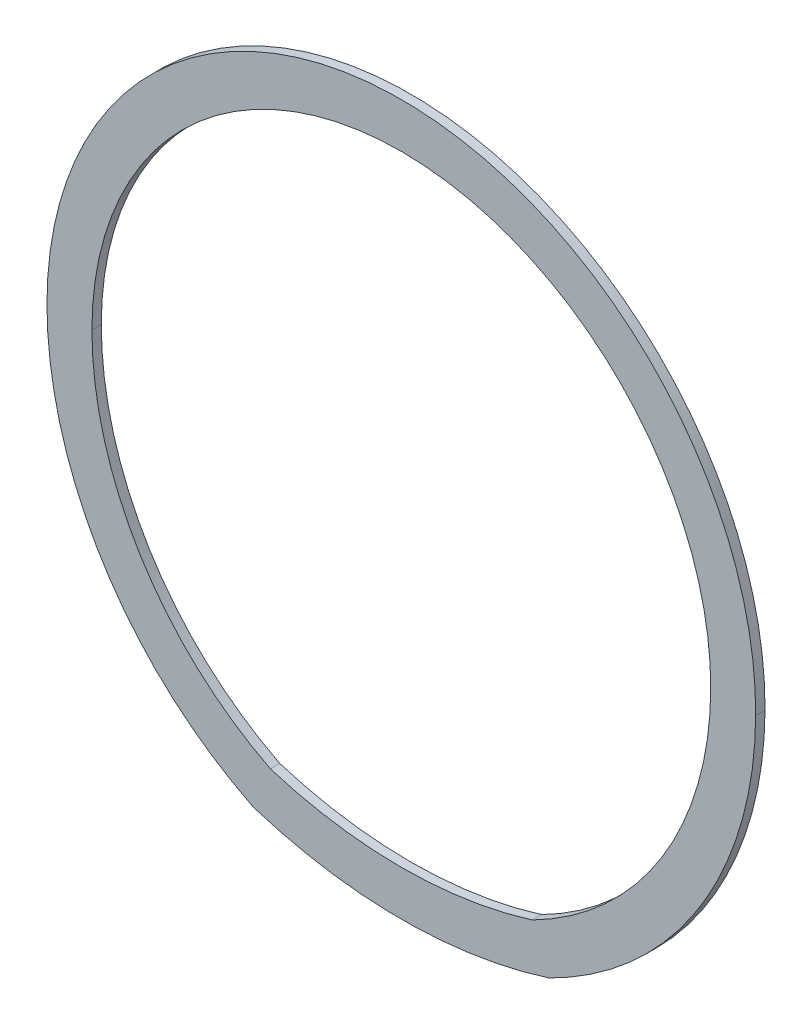
ISO-10303-21;
HEADER;
FILE_DESCRIPTION(('STEP AP214'),'2;1');
FILE_NAME('part.step','',(''),(''),'','','');
FILE_SCHEMA(('AUTOMOTIVE_DESIGN { 1 0 10303 214 1 1 1 1 }'));
ENDSEC;
DATA;
#1=APPLICATION_CONTEXT('core data for automotive mechanical design processes');
#2=APPLICATION_PROTOCOL_DEFINITION('international standard','automotive_design',2000,#1);
#3=PRODUCT_CONTEXT('',#1,'mechanical');
#4=PRODUCT('Part','Part','',(#3));
#5=PRODUCT_RELATED_PRODUCT_CATEGORY('part','',(#4));
#6=PRODUCT_DEFINITION_FORMATION('','',#4);
#7=PRODUCT_DEFINITION_CONTEXT('part definition',#1,'design');
#8=PRODUCT_DEFINITION('design','',#6,#7);
#9=PRODUCT_DEFINITION_SHAPE('','',#8);
#10=(LENGTH_UNIT() NAMED_UNIT(*) SI_UNIT(.MILLI.,.METRE.));
#11=(NAMED_UNIT(*) PLANE_ANGLE_UNIT() SI_UNIT($,.RADIAN.));
#12=(NAMED_UNIT(*) SI_UNIT($,.STERADIAN.) SOLID_ANGLE_UNIT());
#13=UNCERTAINTY_MEASURE_WITH_UNIT(LENGTH_MEASURE(1.E-05),#10,'distance_accuracy_value','');
#14=(GEOMETRIC_REPRESENTATION_CONTEXT(3) GLOBAL_UNCERTAINTY_ASSIGNED_CONTEXT((#13)) GLOBAL_UNIT_ASSIGNED_CONTEXT((#10,
#11,#12)) REPRESENTATION_CONTEXT('',''));
#15=CARTESIAN_POINT('',(0.,0.,0.));
#16=DIRECTION('',(0.,0.,1.));
#17=DIRECTION('',(1.,0.,0.));
#18=AXIS2_PLACEMENT_3D('',#15,#16,#17);
#19=CARTESIAN_POINT('',(2.87745258300709,41.275,1.5875));
#20=DIRECTION('',(0.,0.,1.));
#21=DIRECTION('',(1.,0.,0.));
#22=AXIS2_PLACEMENT_3D('',#19,#20,#21);
#23=PLANE('',#22);
#24=CARTESIAN_POINT('',(5.71473106786189,19.0500000000001,1.5875));
#25=DIRECTION('',(0.,0.,1.));
#26=DIRECTION('',(1.,0.,0.));
#27=AXIS2_PLACEMENT_3D('',#24,#25,#26);
#28=CIRCLE('',#27,125.813626794521);
#29=CARTESIAN_POINT('',(-120.098895726659,19.05,1.5875));
#30=VERTEX_POINT('',#29);
#31=CARTESIAN_POINT('',(-50.0584032460589,-93.7259999999829,1.5875));
#32=VERTEX_POINT('',#31);
#33=EDGE_CURVE('E138',#30,#32,#28,.T.);
#34=ORIENTED_EDGE('',*,*,#33,.T.);
#35=CARTESIAN_POINT('',(0.0401740981522854,63.5,1.5875));
#36=DIRECTION('',(0.,0.,1.));
#37=DIRECTION('',(1.,0.,0.));
#38=AXIS2_PLACEMENT_3D('',#35,#36,#37);
#39=CIRCLE('',#38,165.014794875819);
#40=CARTESIAN_POINT('',(50.138751442251,-93.726,1.5875));
#41=VERTEX_POINT('',#40);
#42=EDGE_CURVE('E141',#32,#41,#39,.T.);
#43=ORIENTED_EDGE('',*,*,#42,.T.);
#44=CARTESIAN_POINT('',(-5.64062361813422,19.0834910459425,1.5875));
#45=DIRECTION('',(0.,0.,1.));
#46=DIRECTION('',(-1.,0.,0.));
#47=AXIS2_PLACEMENT_3D('',#44,#45,#46);
#48=CIRCLE('',#47,125.846414141094);
#49=CARTESIAN_POINT('',(120.203613721784,18.3433015446214,1.5875));
#50=VERTEX_POINT('',#49);
#51=EDGE_CURVE('E144',#41,#50,#48,.T.);
#52=ORIENTED_EDGE('',*,*,#51,.T.);
#53=CARTESIAN_POINT('',(0.0533981517267298,19.05,1.5875));
#54=DIRECTION('',(0.,0.,1.));
#55=DIRECTION('',(-1.,0.,0.));
#56=AXIS2_PLACEMENT_3D('',#53,#54,#55);
#57=CIRCLE('',#56,120.152293878386);
#58=EDGE_CURVE('E146',#50,#30,#57,.T.);
#59=ORIENTED_EDGE('',*,*,#58,.T.);
#60=EDGE_LOOP('',(#34,#43,#52,#59));
#61=FACE_BOUND('',#60,.T.);
#62=CARTESIAN_POINT('',(0.0401740981522854,63.5,1.5875));
#63=DIRECTION('',(0.,0.,1.));
#64=DIRECTION('',(1.,0.,0.));
#65=AXIS2_PLACEMENT_3D('',#62,#63,#64);
#66=CIRCLE('',#65,149.774794875837);
#67=CARTESIAN_POINT('',(-44.3239593744346,-79.5535313836238,1.5875));
#68=VERTEX_POINT('',#67);
#69=CARTESIAN_POINT('',(44.4048605696805,-79.5533598849547,1.5875));
#70=VERTEX_POINT('',#69);
#71=EDGE_CURVE('E110',#68,#70,#66,.T.);
#72=ORIENTED_EDGE('',*,*,#71,.F.);
#73=CARTESIAN_POINT('',(5.71473106786189,19.0500000000001,1.5875));
#74=DIRECTION('',(0.,0.,1.));
#75=DIRECTION('',(1.,0.,0.));
#76=AXIS2_PLACEMENT_3D('',#73,#74,#75);
#77=CIRCLE('',#76,110.573626794554);
#78=CARTESIAN_POINT('',(-104.858895726692,19.05,1.5875));
#79=VERTEX_POINT('',#78);
#80=EDGE_CURVE('E102',#79,#68,#77,.T.);
#81=ORIENTED_EDGE('',*,*,#80,.F.);
#82=CARTESIAN_POINT('',(0.0533981517267298,19.05,1.5875));
#83=DIRECTION('',(0.,0.,1.));
#84=DIRECTION('',(-1.,0.,0.));
#85=AXIS2_PLACEMENT_3D('',#82,#83,#84);
#86=CIRCLE('',#85,104.912293878419);
#87=CARTESIAN_POINT('',(104.963877332422,18.4329384888053,1.5875));
#88=VERTEX_POINT('',#87);
#89=EDGE_CURVE('E124',#88,#79,#86,.T.);
#90=ORIENTED_EDGE('',*,*,#89,.F.);
#91=CARTESIAN_POINT('',(-5.64062361813422,19.0834910459425,1.5875));
#92=DIRECTION('',(0.,0.,1.));
#93=DIRECTION('',(-1.,0.,0.));
#94=AXIS2_PLACEMENT_3D('',#91,#92,#93);
#95=CIRCLE('',#94,110.60641414112);
#96=EDGE_CURVE('E122',#70,#88,#95,.T.);
#97=ORIENTED_EDGE('',*,*,#96,.F.);
#98=EDGE_LOOP('',(#72,#81,#90,#97));
#99=FACE_BOUND('',#98,.T.);
#100=ADVANCED_FACE('F37',(#61,#99),#23,.T.);
#101=CARTESIAN_POINT('',(2.87745258300709,41.275,-1.5875));
#102=DIRECTION('',(0.,0.,1.));
#103=DIRECTION('',(1.,0.,0.));
#104=AXIS2_PLACEMENT_3D('',#101,#102,#103);
#105=PLANE('',#104);
#106=CARTESIAN_POINT('',(5.71473106786189,19.0500000000001,-1.5875));
#107=DIRECTION('',(0.,0.,1.));
#108=DIRECTION('',(1.,0.,0.));
#109=AXIS2_PLACEMENT_3D('',#106,#107,#108);
#110=CIRCLE('',#109,125.813626794521);
#111=CARTESIAN_POINT('',(-120.098895726659,19.05,-1.5875));
#112=VERTEX_POINT('',#111);
#113=CARTESIAN_POINT('',(-50.0584032460589,-93.7259999999829,-1.5875));
#114=VERTEX_POINT('',#113);
#115=EDGE_CURVE('E118',#112,#114,#110,.T.);
#116=ORIENTED_EDGE('',*,*,#115,.F.);
#117=CARTESIAN_POINT('',(0.0533981517267298,19.05,-1.5875));
#118=DIRECTION('',(0.,0.,1.));
#119=DIRECTION('',(-1.,0.,0.));
#120=AXIS2_PLACEMENT_3D('',#117,#118,#119);
#121=CIRCLE('',#120,120.152293878386);
#122=CARTESIAN_POINT('',(120.203613721784,18.3433015446214,-1.5875));
#123=VERTEX_POINT('',#122);
#124=EDGE_CURVE('E142',#123,#112,#121,.T.);
#125=ORIENTED_EDGE('',*,*,#124,.F.);
#126=CARTESIAN_POINT('',(-5.64062361813422,19.0834910459425,-1.5875));
#127=DIRECTION('',(0.,0.,1.));
#128=DIRECTION('',(-1.,0.,0.));
#129=AXIS2_PLACEMENT_3D('',#126,#127,#128);
#130=CIRCLE('',#129,125.846414141094);
#131=CARTESIAN_POINT('',(50.138751442251,-93.726,-1.5875));
#132=VERTEX_POINT('',#131);
#133=EDGE_CURVE('E153',#132,#123,#130,.T.);
#134=ORIENTED_EDGE('',*,*,#133,.F.);
#135=CARTESIAN_POINT('',(0.0401740981522854,63.5,-1.5875));
#136=DIRECTION('',(0.,0.,1.));
#137=DIRECTION('',(1.,0.,0.));
#138=AXIS2_PLACEMENT_3D('',#135,#136,#137);
#139=CIRCLE('',#138,165.014794875819);
#140=EDGE_CURVE('E151',#114,#132,#139,.T.);
#141=ORIENTED_EDGE('',*,*,#140,.F.);
#142=EDGE_LOOP('',(#116,#125,#134,#141));
#143=FACE_BOUND('',#142,.T.);
#144=CARTESIAN_POINT('',(5.71473106786189,19.0500000000001,-1.5875));
#145=DIRECTION('',(0.,0.,1.));
#146=DIRECTION('',(1.,0.,0.));
#147=AXIS2_PLACEMENT_3D('',#144,#145,#146);
#148=CIRCLE('',#147,110.573626794554);
#149=CARTESIAN_POINT('',(-104.858895726692,19.05,-1.5875));
#150=VERTEX_POINT('',#149);
#151=CARTESIAN_POINT('',(-44.3239593744346,-79.5535313836238,-1.5875));
#152=VERTEX_POINT('',#151);
#153=EDGE_CURVE('E60',#150,#152,#148,.T.);
#154=ORIENTED_EDGE('',*,*,#153,.T.);
#155=CARTESIAN_POINT('',(0.0401740981522854,63.5,-1.5875));
#156=DIRECTION('',(0.,0.,1.));
#157=DIRECTION('',(1.,0.,0.));
#158=AXIS2_PLACEMENT_3D('',#155,#156,#157);
#159=CIRCLE('',#158,149.774794875837);
#160=CARTESIAN_POINT('',(44.4048605696805,-79.5533598849547,-1.5875));
#161=VERTEX_POINT('',#160);
#162=EDGE_CURVE('E117',#152,#161,#159,.T.);
#163=ORIENTED_EDGE('',*,*,#162,.T.);
#164=CARTESIAN_POINT('',(-5.64062361813422,19.0834910459425,-1.5875));
#165=DIRECTION('',(0.,0.,1.));
#166=DIRECTION('',(-1.,0.,0.));
#167=AXIS2_PLACEMENT_3D('',#164,#165,#166);
#168=CIRCLE('',#167,110.60641414112);
#169=CARTESIAN_POINT('',(104.963877332422,18.4329384888053,-1.5875));
#170=VERTEX_POINT('',#169);
#171=EDGE_CURVE('E130',#161,#170,#168,.T.);
#172=ORIENTED_EDGE('',*,*,#171,.T.);
#173=CARTESIAN_POINT('',(0.0533981517267298,19.05,-1.5875));
#174=DIRECTION('',(0.,0.,1.));
#175=DIRECTION('',(-1.,0.,0.));
#176=AXIS2_PLACEMENT_3D('',#173,#174,#175);
#177=CIRCLE('',#176,104.912293878419);
#178=EDGE_CURVE('E111',#170,#150,#177,.T.);
#179=ORIENTED_EDGE('',*,*,#178,.T.);
#180=EDGE_LOOP('',(#154,#163,#172,#179));
#181=FACE_BOUND('',#180,.T.);
#182=ADVANCED_FACE('F171',(#143,#181),#105,.F.);
#183=CARTESIAN_POINT('',(5.71473106786189,19.0500000000001,1.5875));
#184=DIRECTION('',(0.,0.,-1.));
#185=DIRECTION('',(-1.,0.,0.));
#186=AXIS2_PLACEMENT_3D('',#183,#184,#185);
#187=CYLINDRICAL_SURFACE('',#186,125.813626794521);
#188=ORIENTED_EDGE('',*,*,#115,.T.);
#189=DIRECTION('',(0.,0.,-1.));
#190=VECTOR('',#189,1.);
#191=CARTESIAN_POINT('',(-50.0584032460589,-93.7259999999829,1.5875));
#192=LINE('',#191,#190);
#193=EDGE_CURVE('E11',#32,#114,#192,.T.);
#194=ORIENTED_EDGE('',*,*,#193,.F.);
#195=ORIENTED_EDGE('',*,*,#33,.F.);
#196=DIRECTION('',(0.,0.,-1.));
#197=VECTOR('',#196,1.);
#198=CARTESIAN_POINT('',(-120.098895726659,19.05,1.5875));
#199=LINE('',#198,#197);
#200=EDGE_CURVE('E148',#30,#112,#199,.T.);
#201=ORIENTED_EDGE('',*,*,#200,.T.);
#202=EDGE_LOOP('',(#188,#194,#195,#201));
#203=FACE_BOUND('',#202,.T.);
#204=ADVANCED_FACE('F39',(#203),#187,.T.);
#205=CARTESIAN_POINT('',(0.0401740981522854,63.5,1.5875));
#206=DIRECTION('',(0.,0.,-1.));
#207=DIRECTION('',(-1.,0.,0.));
#208=AXIS2_PLACEMENT_3D('',#205,#206,#207);
#209=CYLINDRICAL_SURFACE('',#208,165.014794875819);
#210=ORIENTED_EDGE('',*,*,#140,.T.);
#211=DIRECTION('',(0.,0.,-1.));
#212=VECTOR('',#211,1.);
#213=CARTESIAN_POINT('',(50.138751442251,-93.726,1.5875));
#214=LINE('',#213,#212);
#215=EDGE_CURVE('E45',#41,#132,#214,.T.);
#216=ORIENTED_EDGE('',*,*,#215,.F.);
#217=ORIENTED_EDGE('',*,*,#42,.F.);
#218=ORIENTED_EDGE('',*,*,#193,.T.);
#219=EDGE_LOOP('',(#210,#216,#217,#218));
#220=FACE_BOUND('',#219,.T.);
#221=ADVANCED_FACE('F181',(#220),#209,.T.);
#222=CARTESIAN_POINT('',(-5.64062361813422,19.0834910459425,1.5875));
#223=DIRECTION('',(0.,0.,-1.));
#224=DIRECTION('',(-1.,0.,0.));
#225=AXIS2_PLACEMENT_3D('',#222,#223,#224);
#226=CYLINDRICAL_SURFACE('',#225,125.846414141094);
#227=ORIENTED_EDGE('',*,*,#133,.T.);
#228=DIRECTION('',(0.,0.,-1.));
#229=VECTOR('',#228,1.);
#230=CARTESIAN_POINT('',(120.203613721784,18.3433015446214,1.5875));
#231=LINE('',#230,#229);
#232=EDGE_CURVE('E158',#50,#123,#231,.T.);
#233=ORIENTED_EDGE('',*,*,#232,.F.);
#234=ORIENTED_EDGE('',*,*,#51,.F.);
#235=ORIENTED_EDGE('',*,*,#215,.T.);
#236=EDGE_LOOP('',(#227,#233,#234,#235));
#237=FACE_BOUND('',#236,.T.);
#238=ADVANCED_FACE('F165',(#237),#226,.T.);
#239=CARTESIAN_POINT('',(0.0533981517267298,19.05,1.5875));
#240=DIRECTION('',(0.,0.,-1.));
#241=DIRECTION('',(-1.,0.,0.));
#242=AXIS2_PLACEMENT_3D('',#239,#240,#241);
#243=CYLINDRICAL_SURFACE('',#242,120.152293878386);
#244=ORIENTED_EDGE('',*,*,#124,.T.);
#245=ORIENTED_EDGE('',*,*,#200,.F.);
#246=ORIENTED_EDGE('',*,*,#58,.F.);
#247=ORIENTED_EDGE('',*,*,#232,.T.);
#248=EDGE_LOOP('',(#244,#245,#246,#247));
#249=FACE_BOUND('',#248,.T.);
#250=ADVANCED_FACE('F175',(#249),#243,.T.);
#251=CARTESIAN_POINT('',(5.71473106786189,19.0500000000001,1.5875));
#252=DIRECTION('',(0.,0.,-1.));
#253=DIRECTION('',(-1.,0.,0.));
#254=AXIS2_PLACEMENT_3D('',#251,#252,#253);
#255=CYLINDRICAL_SURFACE('',#254,110.573626794554);
#256=ORIENTED_EDGE('',*,*,#153,.F.);
#257=DIRECTION('',(0.,0.,-1.));
#258=VECTOR('',#257,1.);
#259=CARTESIAN_POINT('',(-104.858895726692,19.05,1.5875));
#260=LINE('',#259,#258);
#261=EDGE_CURVE('E106',#79,#150,#260,.T.);
#262=ORIENTED_EDGE('',*,*,#261,.F.);
#263=ORIENTED_EDGE('',*,*,#80,.T.);
#264=DIRECTION('',(0.,0.,-1.));
#265=VECTOR('',#264,1.);
#266=CARTESIAN_POINT('',(-44.3239593744346,-79.5535313836238,1.5875));
#267=LINE('',#266,#265);
#268=EDGE_CURVE('E105',#68,#152,#267,.T.);
#269=ORIENTED_EDGE('',*,*,#268,.T.);
#270=EDGE_LOOP('',(#256,#262,#263,#269));
#271=FACE_BOUND('',#270,.T.);
#272=ADVANCED_FACE('F104',(#271),#255,.F.);
#273=CARTESIAN_POINT('',(0.0401740981522854,63.5,1.5875));
#274=DIRECTION('',(0.,0.,-1.));
#275=DIRECTION('',(-1.,0.,0.));
#276=AXIS2_PLACEMENT_3D('',#273,#274,#275);
#277=CYLINDRICAL_SURFACE('',#276,149.774794875837);
#278=ORIENTED_EDGE('',*,*,#162,.F.);
#279=ORIENTED_EDGE('',*,*,#268,.F.);
#280=ORIENTED_EDGE('',*,*,#71,.T.);
#281=DIRECTION('',(0.,0.,-1.));
#282=VECTOR('',#281,1.);
#283=CARTESIAN_POINT('',(44.4048605696805,-79.5533598849547,1.5875));
#284=LINE('',#283,#282);
#285=EDGE_CURVE('E119',#70,#161,#284,.T.);
#286=ORIENTED_EDGE('',*,*,#285,.T.);
#287=EDGE_LOOP('',(#278,#279,#280,#286));
#288=FACE_BOUND('',#287,.T.);
#289=ADVANCED_FACE('F114',(#288),#277,.F.);
#290=CARTESIAN_POINT('',(-5.64062361813422,19.0834910459425,1.5875));
#291=DIRECTION('',(0.,0.,-1.));
#292=DIRECTION('',(-1.,0.,0.));
#293=AXIS2_PLACEMENT_3D('',#290,#291,#292);
#294=CYLINDRICAL_SURFACE('',#293,110.60641414112);
#295=ORIENTED_EDGE('',*,*,#171,.F.);
#296=ORIENTED_EDGE('',*,*,#285,.F.);
#297=ORIENTED_EDGE('',*,*,#96,.T.);
#298=DIRECTION('',(0.,0.,-1.));
#299=VECTOR('',#298,1.);
#300=CARTESIAN_POINT('',(104.963877332422,18.4329384888053,1.5875));
#301=LINE('',#300,#299);
#302=EDGE_CURVE('E52',#88,#170,#301,.T.);
#303=ORIENTED_EDGE('',*,*,#302,.T.);
#304=EDGE_LOOP('',(#295,#296,#297,#303));
#305=FACE_BOUND('',#304,.T.);
#306=ADVANCED_FACE('F204',(#305),#294,.F.);
#307=CARTESIAN_POINT('',(0.0533981517267298,19.05,1.5875));
#308=DIRECTION('',(0.,0.,-1.));
#309=DIRECTION('',(-1.,0.,0.));
#310=AXIS2_PLACEMENT_3D('',#307,#308,#309);
#311=CYLINDRICAL_SURFACE('',#310,104.912293878419);
#312=ORIENTED_EDGE('',*,*,#178,.F.);
#313=ORIENTED_EDGE('',*,*,#302,.F.);
#314=ORIENTED_EDGE('',*,*,#89,.T.);
#315=ORIENTED_EDGE('',*,*,#261,.T.);
#316=EDGE_LOOP('',(#312,#313,#314,#315));
#317=FACE_BOUND('',#316,.T.);
#318=ADVANCED_FACE('F208',(#317),#311,.F.);
#319=CLOSED_SHELL('',(#100,#182,#204,#221,#238,#250,#272,#289,#306,#318));
#320=MANIFOLD_SOLID_BREP('B2',#319);
#321=ADVANCED_BREP_SHAPE_REPRESENTATION('',(#18,#320),#14);
#322=SHAPE_DEFINITION_REPRESENTATION(#9,#321);
ENDSEC;
END-ISO-10303-21;
